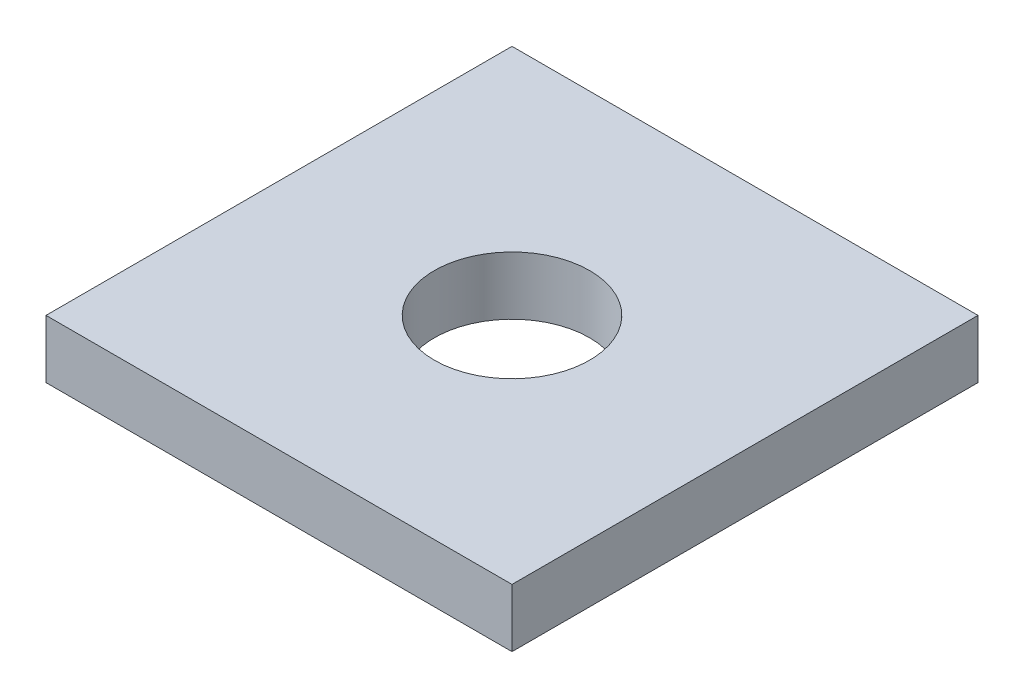
ISO-10303-21;
HEADER;
FILE_DESCRIPTION(('STEP AP214'),'2;1');
FILE_NAME('part.step','',(''),(''),'','','');
FILE_SCHEMA(('AUTOMOTIVE_DESIGN { 1 0 10303 214 1 1 1 1 }'));
ENDSEC;
DATA;
#1=APPLICATION_CONTEXT('core data for automotive mechanical design processes');
#2=APPLICATION_PROTOCOL_DEFINITION('international standard','automotive_design',2000,#1);
#3=PRODUCT_CONTEXT('',#1,'mechanical');
#4=PRODUCT('Part','Part','',(#3));
#5=PRODUCT_RELATED_PRODUCT_CATEGORY('part','',(#4));
#6=PRODUCT_DEFINITION_FORMATION('','',#4);
#7=PRODUCT_DEFINITION_CONTEXT('part definition',#1,'design');
#8=PRODUCT_DEFINITION('design','',#6,#7);
#9=PRODUCT_DEFINITION_SHAPE('','',#8);
#10=(LENGTH_UNIT() NAMED_UNIT(*) SI_UNIT(.MILLI.,.METRE.));
#11=(NAMED_UNIT(*) PLANE_ANGLE_UNIT() SI_UNIT($,.RADIAN.));
#12=(NAMED_UNIT(*) SI_UNIT($,.STERADIAN.) SOLID_ANGLE_UNIT());
#13=UNCERTAINTY_MEASURE_WITH_UNIT(LENGTH_MEASURE(1.E-05),#10,'distance_accuracy_value','');
#14=(GEOMETRIC_REPRESENTATION_CONTEXT(3) GLOBAL_UNCERTAINTY_ASSIGNED_CONTEXT((#13)) GLOBAL_UNIT_ASSIGNED_CONTEXT((#10,
#11,#12)) REPRESENTATION_CONTEXT('',''));
#15=CARTESIAN_POINT('',(0.,0.,0.));
#16=DIRECTION('',(0.,0.,1.));
#17=DIRECTION('',(1.,0.,0.));
#18=AXIS2_PLACEMENT_3D('',#15,#16,#17);
#19=CARTESIAN_POINT('',(6.,1.5,-6.));
#20=DIRECTION('',(0.,-1.,0.));
#21=DIRECTION('',(0.,0.,-1.));
#22=AXIS2_PLACEMENT_3D('',#19,#20,#21);
#23=CYLINDRICAL_SURFACE('',#22,2.);
#24=CARTESIAN_POINT('',(6.,1.5,-6.));
#25=DIRECTION('',(0.,1.,0.));
#26=DIRECTION('',(0.,0.,1.));
#27=AXIS2_PLACEMENT_3D('',#24,#25,#26);
#28=CIRCLE('',#27,2.);
#29=CARTESIAN_POINT('',(6.,1.5,-4.));
#30=VERTEX_POINT('',#29);
#31=EDGE_CURVE('E88',#30,#30,#28,.T.);
#32=ORIENTED_EDGE('',*,*,#31,.T.);
#33=DIRECTION('',(0.,-1.,0.));
#34=VECTOR('',#33,1.);
#35=CARTESIAN_POINT('',(6.,1.5,-4.));
#36=LINE('',#35,#34);
#37=CARTESIAN_POINT('',(6.,0.,-4.));
#38=VERTEX_POINT('',#37);
#39=EDGE_CURVE('E11',#30,#38,#36,.T.);
#40=ORIENTED_EDGE('',*,*,#39,.T.);
#41=CARTESIAN_POINT('',(6.,0.,-6.));
#42=DIRECTION('',(0.,1.,0.));
#43=DIRECTION('',(0.,0.,1.));
#44=AXIS2_PLACEMENT_3D('',#41,#42,#43);
#45=CIRCLE('',#44,2.);
#46=EDGE_CURVE('E115',#38,#38,#45,.T.);
#47=ORIENTED_EDGE('',*,*,#46,.F.);
#48=ORIENTED_EDGE('',*,*,#39,.F.);
#49=EDGE_LOOP('',(#32,#40,#47,#48));
#50=FACE_BOUND('',#49,.T.);
#51=ADVANCED_FACE('F17',(#50),#23,.F.);
#52=CARTESIAN_POINT('',(0.,1.5,-12.));
#53=DIRECTION('',(0.,0.,1.));
#54=DIRECTION('',(1.,0.,0.));
#55=AXIS2_PLACEMENT_3D('',#52,#53,#54);
#56=PLANE('',#55);
#57=DIRECTION('',(-1.,0.,0.));
#58=VECTOR('',#57,1.);
#59=CARTESIAN_POINT('',(12.,0.,-12.));
#60=LINE('',#59,#58);
#61=CARTESIAN_POINT('',(12.,0.,-12.));
#62=VERTEX_POINT('',#61);
#63=CARTESIAN_POINT('',(0.,0.,-12.));
#64=VERTEX_POINT('',#63);
#65=EDGE_CURVE('E72',#62,#64,#60,.T.);
#66=ORIENTED_EDGE('',*,*,#65,.T.);
#67=DIRECTION('',(0.,-1.,0.));
#68=VECTOR('',#67,1.);
#69=CARTESIAN_POINT('',(0.,1.5,-12.));
#70=LINE('',#69,#68);
#71=CARTESIAN_POINT('',(0.,1.5,-12.));
#72=VERTEX_POINT('',#71);
#73=EDGE_CURVE('E65',#72,#64,#70,.T.);
#74=ORIENTED_EDGE('',*,*,#73,.F.);
#75=DIRECTION('',(-1.,0.,0.));
#76=VECTOR('',#75,1.);
#77=CARTESIAN_POINT('',(12.,1.5,-12.));
#78=LINE('',#77,#76);
#79=CARTESIAN_POINT('',(12.,1.5,-12.));
#80=VERTEX_POINT('',#79);
#81=EDGE_CURVE('E69',#80,#72,#78,.T.);
#82=ORIENTED_EDGE('',*,*,#81,.F.);
#83=DIRECTION('',(0.,-1.,0.));
#84=VECTOR('',#83,1.);
#85=CARTESIAN_POINT('',(12.,1.5,-12.));
#86=LINE('',#85,#84);
#87=EDGE_CURVE('E28',#80,#62,#86,.T.);
#88=ORIENTED_EDGE('',*,*,#87,.T.);
#89=EDGE_LOOP('',(#66,#74,#82,#88));
#90=FACE_BOUND('',#89,.T.);
#91=ADVANCED_FACE('F67',(#90),#56,.F.);
#92=CARTESIAN_POINT('',(12.,1.5,0.));
#93=DIRECTION('',(-1.,0.,0.));
#94=DIRECTION('',(0.,1.,0.));
#95=AXIS2_PLACEMENT_3D('',#92,#93,#94);
#96=PLANE('',#95);
#97=DIRECTION('',(0.,0.,-1.));
#98=VECTOR('',#97,1.);
#99=CARTESIAN_POINT('',(12.,0.,0.));
#100=LINE('',#99,#98);
#101=CARTESIAN_POINT('',(12.,0.,0.));
#102=VERTEX_POINT('',#101);
#103=EDGE_CURVE('E120',#102,#62,#100,.T.);
#104=ORIENTED_EDGE('',*,*,#103,.T.);
#105=ORIENTED_EDGE('',*,*,#87,.F.);
#106=DIRECTION('',(0.,0.,-1.));
#107=VECTOR('',#106,1.);
#108=CARTESIAN_POINT('',(12.,1.5,0.));
#109=LINE('',#108,#107);
#110=CARTESIAN_POINT('',(12.,1.5,0.));
#111=VERTEX_POINT('',#110);
#112=EDGE_CURVE('E86',#111,#80,#109,.T.);
#113=ORIENTED_EDGE('',*,*,#112,.F.);
#114=DIRECTION('',(0.,-1.,0.));
#115=VECTOR('',#114,1.);
#116=CARTESIAN_POINT('',(12.,1.5,0.));
#117=LINE('',#116,#115);
#118=EDGE_CURVE('E78',#111,#102,#117,.T.);
#119=ORIENTED_EDGE('',*,*,#118,.T.);
#120=EDGE_LOOP('',(#104,#105,#113,#119));
#121=FACE_BOUND('',#120,.T.);
#122=ADVANCED_FACE('F142',(#121),#96,.F.);
#123=CARTESIAN_POINT('',(0.,1.5,0.));
#124=DIRECTION('',(0.,0.,-1.));
#125=DIRECTION('',(0.,-1.,0.));
#126=AXIS2_PLACEMENT_3D('',#123,#124,#125);
#127=PLANE('',#126);
#128=DIRECTION('',(1.,0.,0.));
#129=VECTOR('',#128,1.);
#130=CARTESIAN_POINT('',(0.,0.,0.));
#131=LINE('',#130,#129);
#132=CARTESIAN_POINT('',(0.,0.,0.));
#133=VERTEX_POINT('',#132);
#134=EDGE_CURVE('E106',#133,#102,#131,.T.);
#135=ORIENTED_EDGE('',*,*,#134,.T.);
#136=ORIENTED_EDGE('',*,*,#118,.F.);
#137=DIRECTION('',(1.,0.,0.));
#138=VECTOR('',#137,1.);
#139=CARTESIAN_POINT('',(0.,1.5,0.));
#140=LINE('',#139,#138);
#141=CARTESIAN_POINT('',(0.,1.5,0.));
#142=VERTEX_POINT('',#141);
#143=EDGE_CURVE('E94',#142,#111,#140,.T.);
#144=ORIENTED_EDGE('',*,*,#143,.F.);
#145=DIRECTION('',(0.,-1.,0.));
#146=VECTOR('',#145,1.);
#147=CARTESIAN_POINT('',(0.,1.5,0.));
#148=LINE('',#147,#146);
#149=EDGE_CURVE('E79',#142,#133,#148,.T.);
#150=ORIENTED_EDGE('',*,*,#149,.T.);
#151=EDGE_LOOP('',(#135,#136,#144,#150));
#152=FACE_BOUND('',#151,.T.);
#153=ADVANCED_FACE('F19',(#152),#127,.F.);
#154=CARTESIAN_POINT('',(0.,1.5,0.));
#155=DIRECTION('',(1.,0.,0.));
#156=DIRECTION('',(0.,0.,-1.));
#157=AXIS2_PLACEMENT_3D('',#154,#155,#156);
#158=PLANE('',#157);
#159=DIRECTION('',(0.,0.,1.));
#160=VECTOR('',#159,1.);
#161=CARTESIAN_POINT('',(0.,0.,-12.));
#162=LINE('',#161,#160);
#163=EDGE_CURVE('E108',#64,#133,#162,.T.);
#164=ORIENTED_EDGE('',*,*,#163,.T.);
#165=ORIENTED_EDGE('',*,*,#149,.F.);
#166=DIRECTION('',(0.,0.,1.));
#167=VECTOR('',#166,1.);
#168=CARTESIAN_POINT('',(0.,1.5,-12.));
#169=LINE('',#168,#167);
#170=EDGE_CURVE('E21',#72,#142,#169,.T.);
#171=ORIENTED_EDGE('',*,*,#170,.F.);
#172=ORIENTED_EDGE('',*,*,#73,.T.);
#173=EDGE_LOOP('',(#164,#165,#171,#172));
#174=FACE_BOUND('',#173,.T.);
#175=ADVANCED_FACE('F90',(#174),#158,.F.);
#176=CARTESIAN_POINT('',(0.,0.,0.));
#177=DIRECTION('',(0.,-1.,0.));
#178=DIRECTION('',(0.,0.,-1.));
#179=AXIS2_PLACEMENT_3D('',#176,#177,#178);
#180=PLANE('',#179);
#181=ORIENTED_EDGE('',*,*,#46,.T.);
#182=EDGE_LOOP('',(#181));
#183=FACE_BOUND('',#182,.T.);
#184=ORIENTED_EDGE('',*,*,#163,.F.);
#185=ORIENTED_EDGE('',*,*,#65,.F.);
#186=ORIENTED_EDGE('',*,*,#103,.F.);
#187=ORIENTED_EDGE('',*,*,#134,.F.);
#188=EDGE_LOOP('',(#184,#185,#186,#187));
#189=FACE_BOUND('',#188,.T.);
#190=ADVANCED_FACE('F129',(#183,#189),#180,.T.);
#191=CARTESIAN_POINT('',(0.,1.5,0.));
#192=DIRECTION('',(0.,-1.,0.));
#193=DIRECTION('',(0.,0.,-1.));
#194=AXIS2_PLACEMENT_3D('',#191,#192,#193);
#195=PLANE('',#194);
#196=ORIENTED_EDGE('',*,*,#31,.F.);
#197=EDGE_LOOP('',(#196));
#198=FACE_BOUND('',#197,.T.);
#199=ORIENTED_EDGE('',*,*,#170,.T.);
#200=ORIENTED_EDGE('',*,*,#143,.T.);
#201=ORIENTED_EDGE('',*,*,#112,.T.);
#202=ORIENTED_EDGE('',*,*,#81,.T.);
#203=EDGE_LOOP('',(#199,#200,#201,#202));
#204=FACE_BOUND('',#203,.T.);
#205=ADVANCED_FACE('F83',(#198,#204),#195,.F.);
#206=CLOSED_SHELL('',(#51,#91,#122,#153,#175,#190,#205));
#207=MANIFOLD_SOLID_BREP('B1',#206);
#208=ADVANCED_BREP_SHAPE_REPRESENTATION('',(#18,#207),#14);
#209=SHAPE_DEFINITION_REPRESENTATION(#9,#208);
ENDSEC;
END-ISO-10303-21;
